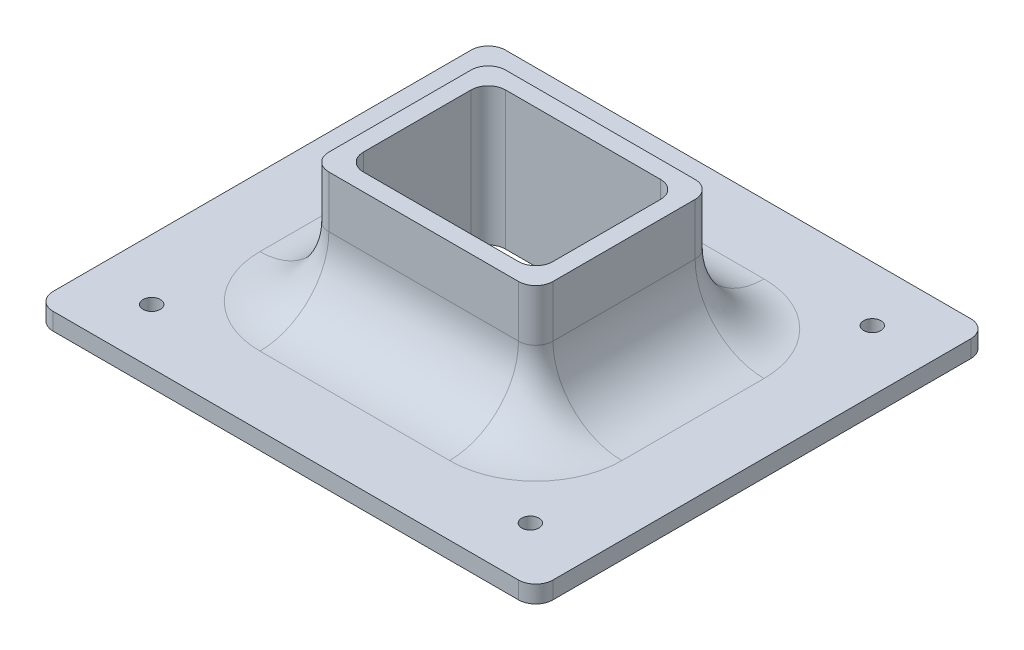
ISO-10303-21;
HEADER;
FILE_DESCRIPTION(('STEP AP214'),'2;1');
FILE_NAME('part.step','',(''),(''),'','','');
FILE_SCHEMA(('AUTOMOTIVE_DESIGN { 1 0 10303 214 1 1 1 1 }'));
ENDSEC;
DATA;
#1=APPLICATION_CONTEXT('core data for automotive mechanical design processes');
#2=APPLICATION_PROTOCOL_DEFINITION('international standard','automotive_design',2000,#1);
#3=PRODUCT_CONTEXT('',#1,'mechanical');
#4=PRODUCT('Part','Part','',(#3));
#5=PRODUCT_RELATED_PRODUCT_CATEGORY('part','',(#4));
#6=PRODUCT_DEFINITION_FORMATION('','',#4);
#7=PRODUCT_DEFINITION_CONTEXT('part definition',#1,'design');
#8=PRODUCT_DEFINITION('design','',#6,#7);
#9=PRODUCT_DEFINITION_SHAPE('','',#8);
#10=(LENGTH_UNIT() NAMED_UNIT(*) SI_UNIT(.MILLI.,.METRE.));
#11=(NAMED_UNIT(*) PLANE_ANGLE_UNIT() SI_UNIT($,.RADIAN.));
#12=(NAMED_UNIT(*) SI_UNIT($,.STERADIAN.) SOLID_ANGLE_UNIT());
#13=UNCERTAINTY_MEASURE_WITH_UNIT(LENGTH_MEASURE(1.E-05),#10,'distance_accuracy_value','');
#14=(GEOMETRIC_REPRESENTATION_CONTEXT(3) GLOBAL_UNCERTAINTY_ASSIGNED_CONTEXT((#13)) GLOBAL_UNIT_ASSIGNED_CONTEXT((#10,
#11,#12)) REPRESENTATION_CONTEXT('',''));
#15=CARTESIAN_POINT('',(0.,0.,0.));
#16=DIRECTION('',(0.,0.,1.));
#17=DIRECTION('',(1.,0.,0.));
#18=AXIS2_PLACEMENT_3D('',#15,#16,#17);
#19=CARTESIAN_POINT('',(0.,44.45,0.));
#20=DIRECTION('',(0.,-1.,0.));
#21=DIRECTION('',(0.,0.,-1.));
#22=AXIS2_PLACEMENT_3D('',#19,#20,#21);
#23=PLANE('',#22);
#24=DIRECTION('',(-1.,0.,0.));
#25=VECTOR('',#24,1.);
#26=CARTESIAN_POINT('',(-6.35,44.45,-58.7248));
#27=LINE('',#26,#25);
#28=CARTESIAN_POINT('',(69.85,44.45,-58.7248));
#29=VERTEX_POINT('',#28);
#30=CARTESIAN_POINT('',(0.,44.45,-58.7248));
#31=VERTEX_POINT('',#30);
#32=EDGE_CURVE('E368',#29,#31,#27,.T.);
#33=ORIENTED_EDGE('',*,*,#32,.T.);
#34=CARTESIAN_POINT('',(0.,44.45,-52.3748));
#35=DIRECTION('',(0.,-1.,0.));
#36=DIRECTION('',(0.,0.,-1.));
#37=AXIS2_PLACEMENT_3D('',#34,#35,#36);
#38=CIRCLE('',#37,6.35);
#39=CARTESIAN_POINT('',(-6.35,44.45,-52.3748));
#40=VERTEX_POINT('',#39);
#41=EDGE_CURVE('E465',#31,#40,#38,.F.);
#42=ORIENTED_EDGE('',*,*,#41,.T.);
#43=DIRECTION('',(0.,0.,1.));
#44=VECTOR('',#43,1.);
#45=CARTESIAN_POINT('',(-6.35,44.45,6.35));
#46=LINE('',#45,#44);
#47=CARTESIAN_POINT('',(-6.35,44.45,0.));
#48=VERTEX_POINT('',#47);
#49=EDGE_CURVE('E356',#40,#48,#46,.T.);
#50=ORIENTED_EDGE('',*,*,#49,.T.);
#51=CARTESIAN_POINT('',(0.,44.45,0.));
#52=DIRECTION('',(0.,-1.,0.));
#53=DIRECTION('',(0.,0.,-1.));
#54=AXIS2_PLACEMENT_3D('',#51,#52,#53);
#55=CIRCLE('',#54,6.35);
#56=CARTESIAN_POINT('',(0.,44.45,6.35));
#57=VERTEX_POINT('',#56);
#58=EDGE_CURVE('E462',#48,#57,#55,.F.);
#59=ORIENTED_EDGE('',*,*,#58,.T.);
#60=DIRECTION('',(1.,0.,0.));
#61=VECTOR('',#60,1.);
#62=CARTESIAN_POINT('',(-6.35,44.45,6.35));
#63=LINE('',#62,#61);
#64=CARTESIAN_POINT('',(69.85,44.45,6.35));
#65=VERTEX_POINT('',#64);
#66=EDGE_CURVE('E360',#57,#65,#63,.T.);
#67=ORIENTED_EDGE('',*,*,#66,.T.);
#68=CARTESIAN_POINT('',(69.85,44.45,0.));
#69=DIRECTION('',(0.,-1.,0.));
#70=DIRECTION('',(0.,0.,-1.));
#71=AXIS2_PLACEMENT_3D('',#68,#69,#70);
#72=CIRCLE('',#71,6.35);
#73=CARTESIAN_POINT('',(76.2,44.45,0.));
#74=VERTEX_POINT('',#73);
#75=EDGE_CURVE('E456',#65,#74,#72,.F.);
#76=ORIENTED_EDGE('',*,*,#75,.T.);
#77=DIRECTION('',(0.,0.,-1.));
#78=VECTOR('',#77,1.);
#79=CARTESIAN_POINT('',(76.2,44.45,6.35));
#80=LINE('',#79,#78);
#81=CARTESIAN_POINT('',(76.2,44.45,-52.3748));
#82=VERTEX_POINT('',#81);
#83=EDGE_CURVE('E364',#74,#82,#80,.T.);
#84=ORIENTED_EDGE('',*,*,#83,.T.);
#85=CARTESIAN_POINT('',(69.85,44.45,-52.3748));
#86=DIRECTION('',(0.,-1.,0.));
#87=DIRECTION('',(0.,0.,-1.));
#88=AXIS2_PLACEMENT_3D('',#85,#86,#87);
#89=CIRCLE('',#88,6.35);
#90=EDGE_CURVE('E459',#82,#29,#89,.F.);
#91=ORIENTED_EDGE('',*,*,#90,.T.);
#92=EDGE_LOOP('',(#33,#42,#50,#59,#67,#76,#84,#91));
#93=FACE_BOUND('',#92,.T.);
#94=DIRECTION('',(0.,0.,1.));
#95=VECTOR('',#94,1.);
#96=CARTESIAN_POINT('',(0.,44.45,0.));
#97=LINE('',#96,#95);
#98=CARTESIAN_POINT('',(0.,44.45,-46.0248));
#99=VERTEX_POINT('',#98);
#100=CARTESIAN_POINT('',(0.,44.45,-6.35));
#101=VERTEX_POINT('',#100);
#102=EDGE_CURVE('E327',#99,#101,#97,.T.);
#103=ORIENTED_EDGE('',*,*,#102,.F.);
#104=CARTESIAN_POINT('',(6.35,44.45,-46.0248));
#105=DIRECTION('',(0.,-1.,0.));
#106=DIRECTION('',(0.,0.,-1.));
#107=AXIS2_PLACEMENT_3D('',#104,#105,#106);
#108=CIRCLE('',#107,6.35);
#109=CARTESIAN_POINT('',(6.35,44.45,-52.3748));
#110=VERTEX_POINT('',#109);
#111=EDGE_CURVE('E236',#99,#110,#108,.T.);
#112=ORIENTED_EDGE('',*,*,#111,.T.);
#113=DIRECTION('',(-1.,0.,0.));
#114=VECTOR('',#113,1.);
#115=CARTESIAN_POINT('',(0.,44.45,-52.3748));
#116=LINE('',#115,#114);
#117=CARTESIAN_POINT('',(63.5,44.45,-52.3748));
#118=VERTEX_POINT('',#117);
#119=EDGE_CURVE('E352',#118,#110,#116,.T.);
#120=ORIENTED_EDGE('',*,*,#119,.F.);
#121=CARTESIAN_POINT('',(63.5,44.45,-46.0248));
#122=DIRECTION('',(0.,-1.,0.));
#123=DIRECTION('',(0.,0.,-1.));
#124=AXIS2_PLACEMENT_3D('',#121,#122,#123);
#125=CIRCLE('',#124,6.35);
#126=CARTESIAN_POINT('',(69.85,44.45,-46.0248));
#127=VERTEX_POINT('',#126);
#128=EDGE_CURVE('E488',#118,#127,#125,.T.);
#129=ORIENTED_EDGE('',*,*,#128,.T.);
#130=DIRECTION('',(0.,0.,-1.));
#131=VECTOR('',#130,1.);
#132=CARTESIAN_POINT('',(69.85,44.45,0.));
#133=LINE('',#132,#131);
#134=CARTESIAN_POINT('',(69.85,44.45,-6.35));
#135=VERTEX_POINT('',#134);
#136=EDGE_CURVE('E348',#135,#127,#133,.T.);
#137=ORIENTED_EDGE('',*,*,#136,.F.);
#138=CARTESIAN_POINT('',(63.5,44.45,-6.35));
#139=DIRECTION('',(0.,-1.,0.));
#140=DIRECTION('',(0.,0.,-1.));
#141=AXIS2_PLACEMENT_3D('',#138,#139,#140);
#142=CIRCLE('',#141,6.35);
#143=CARTESIAN_POINT('',(63.5,44.45,0.));
#144=VERTEX_POINT('',#143);
#145=EDGE_CURVE('E485',#135,#144,#142,.T.);
#146=ORIENTED_EDGE('',*,*,#145,.T.);
#147=DIRECTION('',(1.,0.,0.));
#148=VECTOR('',#147,1.);
#149=CARTESIAN_POINT('',(0.,44.45,0.));
#150=LINE('',#149,#148);
#151=CARTESIAN_POINT('',(6.35,44.45,0.));
#152=VERTEX_POINT('',#151);
#153=EDGE_CURVE('E344',#152,#144,#150,.T.);
#154=ORIENTED_EDGE('',*,*,#153,.F.);
#155=CARTESIAN_POINT('',(6.35,44.45,-6.35));
#156=DIRECTION('',(0.,-1.,0.));
#157=DIRECTION('',(0.,0.,-1.));
#158=AXIS2_PLACEMENT_3D('',#155,#156,#157);
#159=CIRCLE('',#158,6.35);
#160=EDGE_CURVE('E482',#152,#101,#159,.T.);
#161=ORIENTED_EDGE('',*,*,#160,.T.);
#162=EDGE_LOOP('',(#103,#112,#120,#129,#137,#146,#154,#161));
#163=FACE_BOUND('',#162,.T.);
#164=ADVANCED_FACE('F41',(#93,#163),#23,.F.);
#165=CARTESIAN_POINT('',(-6.35,44.45,6.35));
#166=DIRECTION('',(1.,0.,0.));
#167=DIRECTION('',(0.,0.,-1.));
#168=AXIS2_PLACEMENT_3D('',#165,#166,#167);
#169=PLANE('',#168);
#170=DIRECTION('',(0.,-1.,0.));
#171=VECTOR('',#170,1.);
#172=CARTESIAN_POINT('',(-6.35,44.45,-52.3748));
#173=LINE('',#172,#171);
#174=CARTESIAN_POINT('',(-6.35,25.4,-52.3748));
#175=VERTEX_POINT('',#174);
#176=EDGE_CURVE('E446',#40,#175,#173,.T.);
#177=ORIENTED_EDGE('',*,*,#176,.T.);
#178=DIRECTION('',(0.,0.,1.));
#179=VECTOR('',#178,1.);
#180=CARTESIAN_POINT('',(-6.35,25.4,6.35));
#181=LINE('',#180,#179);
#182=CARTESIAN_POINT('',(-6.35,25.4,0.));
#183=VERTEX_POINT('',#182);
#184=EDGE_CURVE('E534',#175,#183,#181,.T.);
#185=ORIENTED_EDGE('',*,*,#184,.T.);
#186=DIRECTION('',(0.,-1.,0.));
#187=VECTOR('',#186,1.);
#188=CARTESIAN_POINT('',(-6.35,44.45,0.));
#189=LINE('',#188,#187);
#190=EDGE_CURVE('E443',#183,#48,#189,.F.);
#191=ORIENTED_EDGE('',*,*,#190,.T.);
#192=ORIENTED_EDGE('',*,*,#49,.F.);
#193=EDGE_LOOP('',(#177,#185,#191,#192));
#194=FACE_BOUND('',#193,.T.);
#195=ADVANCED_FACE('F625',(#194),#169,.F.);
#196=CARTESIAN_POINT('',(-6.35,44.45,6.35));
#197=DIRECTION('',(0.,0.,-1.));
#198=DIRECTION('',(-1.,0.,0.));
#199=AXIS2_PLACEMENT_3D('',#196,#197,#198);
#200=PLANE('',#199);
#201=DIRECTION('',(0.,-1.,0.));
#202=VECTOR('',#201,1.);
#203=CARTESIAN_POINT('',(0.,44.45,6.35));
#204=LINE('',#203,#202);
#205=CARTESIAN_POINT('',(0.,25.4,6.35));
#206=VERTEX_POINT('',#205);
#207=EDGE_CURVE('E471',#57,#206,#204,.T.);
#208=ORIENTED_EDGE('',*,*,#207,.T.);
#209=DIRECTION('',(1.,0.,0.));
#210=VECTOR('',#209,1.);
#211=CARTESIAN_POINT('',(-6.35,25.4,6.35));
#212=LINE('',#211,#210);
#213=CARTESIAN_POINT('',(69.85,25.4,6.35));
#214=VERTEX_POINT('',#213);
#215=EDGE_CURVE('E528',#206,#214,#212,.T.);
#216=ORIENTED_EDGE('',*,*,#215,.T.);
#217=DIRECTION('',(0.,-1.,0.));
#218=VECTOR('',#217,1.);
#219=CARTESIAN_POINT('',(69.85,44.45,6.35));
#220=LINE('',#219,#218);
#221=EDGE_CURVE('E468',#214,#65,#220,.F.);
#222=ORIENTED_EDGE('',*,*,#221,.T.);
#223=ORIENTED_EDGE('',*,*,#66,.F.);
#224=EDGE_LOOP('',(#208,#216,#222,#223));
#225=FACE_BOUND('',#224,.T.);
#226=ADVANCED_FACE('F584',(#225),#200,.F.);
#227=CARTESIAN_POINT('',(76.2,44.45,6.35));
#228=DIRECTION('',(-1.,0.,0.));
#229=DIRECTION('',(0.,0.,1.));
#230=AXIS2_PLACEMENT_3D('',#227,#228,#229);
#231=PLANE('',#230);
#232=DIRECTION('',(0.,-1.,0.));
#233=VECTOR('',#232,1.);
#234=CARTESIAN_POINT('',(76.2,44.45,0.));
#235=LINE('',#234,#233);
#236=CARTESIAN_POINT('',(76.2,25.4,0.));
#237=VERTEX_POINT('',#236);
#238=EDGE_CURVE('E475',#74,#237,#235,.T.);
#239=ORIENTED_EDGE('',*,*,#238,.T.);
#240=DIRECTION('',(0.,0.,-1.));
#241=VECTOR('',#240,1.);
#242=CARTESIAN_POINT('',(76.2,25.4,6.35));
#243=LINE('',#242,#241);
#244=CARTESIAN_POINT('',(76.2,25.4,-52.3748));
#245=VERTEX_POINT('',#244);
#246=EDGE_CURVE('E522',#237,#245,#243,.T.);
#247=ORIENTED_EDGE('',*,*,#246,.T.);
#248=DIRECTION('',(0.,-1.,0.));
#249=VECTOR('',#248,1.);
#250=CARTESIAN_POINT('',(76.2,44.45,-52.3748));
#251=LINE('',#250,#249);
#252=EDGE_CURVE('E479',#245,#82,#251,.F.);
#253=ORIENTED_EDGE('',*,*,#252,.T.);
#254=ORIENTED_EDGE('',*,*,#83,.F.);
#255=EDGE_LOOP('',(#239,#247,#253,#254));
#256=FACE_BOUND('',#255,.T.);
#257=ADVANCED_FACE('F597',(#256),#231,.F.);
#258=CARTESIAN_POINT('',(-6.35,44.45,-58.7248));
#259=DIRECTION('',(0.,0.,1.));
#260=DIRECTION('',(1.,0.,0.));
#261=AXIS2_PLACEMENT_3D('',#258,#259,#260);
#262=PLANE('',#261);
#263=DIRECTION('',(0.,-1.,0.));
#264=VECTOR('',#263,1.);
#265=CARTESIAN_POINT('',(69.85,44.45,-58.7248));
#266=LINE('',#265,#264);
#267=CARTESIAN_POINT('',(69.85,25.4,-58.7248));
#268=VERTEX_POINT('',#267);
#269=EDGE_CURVE('E450',#29,#268,#266,.T.);
#270=ORIENTED_EDGE('',*,*,#269,.T.);
#271=DIRECTION('',(-1.,0.,0.));
#272=VECTOR('',#271,1.);
#273=CARTESIAN_POINT('',(-6.35,25.4,-58.7248));
#274=LINE('',#273,#272);
#275=CARTESIAN_POINT('',(0.,25.4,-58.7248));
#276=VERTEX_POINT('',#275);
#277=EDGE_CURVE('E11',#268,#276,#274,.T.);
#278=ORIENTED_EDGE('',*,*,#277,.T.);
#279=DIRECTION('',(0.,-1.,0.));
#280=VECTOR('',#279,1.);
#281=CARTESIAN_POINT('',(0.,44.45,-58.7248));
#282=LINE('',#281,#280);
#283=EDGE_CURVE('E453',#276,#31,#282,.F.);
#284=ORIENTED_EDGE('',*,*,#283,.T.);
#285=ORIENTED_EDGE('',*,*,#32,.F.);
#286=EDGE_LOOP('',(#270,#278,#284,#285));
#287=FACE_BOUND('',#286,.T.);
#288=ADVANCED_FACE('F617',(#287),#262,.F.);
#289=CARTESIAN_POINT('',(0.,44.45,0.));
#290=DIRECTION('',(1.,0.,0.));
#291=DIRECTION('',(0.,0.,-1.));
#292=AXIS2_PLACEMENT_3D('',#289,#290,#291);
#293=PLANE('',#292);
#294=ORIENTED_EDGE('',*,*,#102,.T.);
#295=DIRECTION('',(0.,-1.,0.));
#296=VECTOR('',#295,1.);
#297=CARTESIAN_POINT('',(0.,0.,-6.35));
#298=LINE('',#297,#296);
#299=CARTESIAN_POINT('',(0.,-6.35,-6.35));
#300=VERTEX_POINT('',#299);
#301=EDGE_CURVE('E59',#101,#300,#298,.T.);
#302=ORIENTED_EDGE('',*,*,#301,.T.);
#303=DIRECTION('',(0.,0.,1.));
#304=VECTOR('',#303,1.);
#305=CARTESIAN_POINT('',(0.,-6.35,-46.0248));
#306=LINE('',#305,#304);
#307=CARTESIAN_POINT('',(0.,-6.35,-46.0248));
#308=VERTEX_POINT('',#307);
#309=EDGE_CURVE('E242',#308,#300,#306,.T.);
#310=ORIENTED_EDGE('',*,*,#309,.F.);
#311=DIRECTION('',(0.,-1.,0.));
#312=VECTOR('',#311,1.);
#313=CARTESIAN_POINT('',(0.,44.45,-46.0248));
#314=LINE('',#313,#312);
#315=EDGE_CURVE('E230',#308,#99,#314,.F.);
#316=ORIENTED_EDGE('',*,*,#315,.T.);
#317=EDGE_LOOP('',(#294,#302,#310,#316));
#318=FACE_BOUND('',#317,.T.);
#319=ADVANCED_FACE('F243',(#318),#293,.T.);
#320=CARTESIAN_POINT('',(0.,44.45,0.));
#321=DIRECTION('',(0.,0.,-1.));
#322=DIRECTION('',(-1.,0.,0.));
#323=AXIS2_PLACEMENT_3D('',#320,#321,#322);
#324=PLANE('',#323);
#325=DIRECTION('',(0.,-1.,0.));
#326=VECTOR('',#325,1.);
#327=CARTESIAN_POINT('',(63.5,0.,0.));
#328=LINE('',#327,#326);
#329=CARTESIAN_POINT('',(63.5,-6.35,0.));
#330=VERTEX_POINT('',#329);
#331=EDGE_CURVE('E425',#144,#330,#328,.T.);
#332=ORIENTED_EDGE('',*,*,#331,.T.);
#333=DIRECTION('',(1.,0.,0.));
#334=VECTOR('',#333,1.);
#335=CARTESIAN_POINT('',(6.35,-6.35,0.));
#336=LINE('',#335,#334);
#337=CARTESIAN_POINT('',(6.35,-6.35,0.));
#338=VERTEX_POINT('',#337);
#339=EDGE_CURVE('E259',#338,#330,#336,.T.);
#340=ORIENTED_EDGE('',*,*,#339,.F.);
#341=DIRECTION('',(0.,-1.,0.));
#342=VECTOR('',#341,1.);
#343=CARTESIAN_POINT('',(6.35,44.45,0.));
#344=LINE('',#343,#342);
#345=EDGE_CURVE('E428',#338,#152,#344,.F.);
#346=ORIENTED_EDGE('',*,*,#345,.T.);
#347=ORIENTED_EDGE('',*,*,#153,.T.);
#348=EDGE_LOOP('',(#332,#340,#346,#347));
#349=FACE_BOUND('',#348,.T.);
#350=ADVANCED_FACE('F744',(#349),#324,.T.);
#351=CARTESIAN_POINT('',(69.85,44.45,0.));
#352=DIRECTION('',(-1.,0.,0.));
#353=DIRECTION('',(0.,0.,1.));
#354=AXIS2_PLACEMENT_3D('',#351,#352,#353);
#355=PLANE('',#354);
#356=DIRECTION('',(0.,-1.,0.));
#357=VECTOR('',#356,1.);
#358=CARTESIAN_POINT('',(69.85,0.,-46.0248));
#359=LINE('',#358,#357);
#360=CARTESIAN_POINT('',(69.85,-6.35,-46.0248));
#361=VERTEX_POINT('',#360);
#362=EDGE_CURVE('E431',#127,#361,#359,.T.);
#363=ORIENTED_EDGE('',*,*,#362,.T.);
#364=DIRECTION('',(0.,0.,-1.));
#365=VECTOR('',#364,1.);
#366=CARTESIAN_POINT('',(69.85,-6.35,-6.35));
#367=LINE('',#366,#365);
#368=CARTESIAN_POINT('',(69.85,-6.35,-6.35));
#369=VERTEX_POINT('',#368);
#370=EDGE_CURVE('E267',#369,#361,#367,.T.);
#371=ORIENTED_EDGE('',*,*,#370,.F.);
#372=DIRECTION('',(0.,-1.,0.));
#373=VECTOR('',#372,1.);
#374=CARTESIAN_POINT('',(69.85,44.45,-6.35));
#375=LINE('',#374,#373);
#376=EDGE_CURVE('E434',#369,#135,#375,.F.);
#377=ORIENTED_EDGE('',*,*,#376,.T.);
#378=ORIENTED_EDGE('',*,*,#136,.T.);
#379=EDGE_LOOP('',(#363,#371,#377,#378));
#380=FACE_BOUND('',#379,.T.);
#381=ADVANCED_FACE('F740',(#380),#355,.T.);
#382=CARTESIAN_POINT('',(0.,44.45,-52.3748));
#383=DIRECTION('',(0.,0.,1.));
#384=DIRECTION('',(1.,0.,0.));
#385=AXIS2_PLACEMENT_3D('',#382,#383,#384);
#386=PLANE('',#385);
#387=DIRECTION('',(0.,-1.,0.));
#388=VECTOR('',#387,1.);
#389=CARTESIAN_POINT('',(6.35,0.,-52.3748));
#390=LINE('',#389,#388);
#391=CARTESIAN_POINT('',(6.35,-6.35,-52.3748));
#392=VERTEX_POINT('',#391);
#393=EDGE_CURVE('E437',#110,#392,#390,.T.);
#394=ORIENTED_EDGE('',*,*,#393,.T.);
#395=DIRECTION('',(-1.,0.,0.));
#396=VECTOR('',#395,1.);
#397=CARTESIAN_POINT('',(63.5,-6.35,-52.3748));
#398=LINE('',#397,#396);
#399=CARTESIAN_POINT('',(63.5,-6.35,-52.3748));
#400=VERTEX_POINT('',#399);
#401=EDGE_CURVE('E253',#400,#392,#398,.T.);
#402=ORIENTED_EDGE('',*,*,#401,.F.);
#403=DIRECTION('',(0.,-1.,0.));
#404=VECTOR('',#403,1.);
#405=CARTESIAN_POINT('',(63.5,44.45,-52.3748));
#406=LINE('',#405,#404);
#407=EDGE_CURVE('E440',#400,#118,#406,.F.);
#408=ORIENTED_EDGE('',*,*,#407,.T.);
#409=ORIENTED_EDGE('',*,*,#119,.T.);
#410=EDGE_LOOP('',(#394,#402,#408,#409));
#411=FACE_BOUND('',#410,.T.);
#412=ADVANCED_FACE('F722',(#411),#386,.T.);
#413=CARTESIAN_POINT('',(0.,0.,0.));
#414=DIRECTION('',(0.,1.,0.));
#415=DIRECTION('',(0.,0.,1.));
#416=AXIS2_PLACEMENT_3D('',#413,#414,#415);
#417=PLANE('',#416);
#418=DIRECTION('',(-1.,0.,0.));
#419=VECTOR('',#418,1.);
#420=CARTESIAN_POINT('',(0.,0.,-84.1248));
#421=LINE('',#420,#419);
#422=CARTESIAN_POINT('',(0.,0.,-84.1248));
#423=VERTEX_POINT('',#422);
#424=CARTESIAN_POINT('',(69.85,0.,-84.1248));
#425=VERTEX_POINT('',#424);
#426=EDGE_CURVE('E493',#423,#425,#421,.F.);
#427=ORIENTED_EDGE('',*,*,#426,.T.);
#428=CARTESIAN_POINT('',(69.85,0.,-52.3748));
#429=DIRECTION('',(0.,1.,0.));
#430=DIRECTION('',(0.,0.,1.));
#431=AXIS2_PLACEMENT_3D('',#428,#429,#430);
#432=CIRCLE('',#431,31.75);
#433=CARTESIAN_POINT('',(101.6,0.,-52.3748));
#434=VERTEX_POINT('',#433);
#435=EDGE_CURVE('E514',#425,#434,#432,.F.);
#436=ORIENTED_EDGE('',*,*,#435,.T.);
#437=DIRECTION('',(0.,0.,-1.));
#438=VECTOR('',#437,1.);
#439=CARTESIAN_POINT('',(101.6,0.,0.));
#440=LINE('',#439,#438);
#441=CARTESIAN_POINT('',(101.6,0.,0.));
#442=VERTEX_POINT('',#441);
#443=EDGE_CURVE('E511',#434,#442,#440,.F.);
#444=ORIENTED_EDGE('',*,*,#443,.T.);
#445=CARTESIAN_POINT('',(69.85,0.,0.));
#446=DIRECTION('',(0.,1.,0.));
#447=DIRECTION('',(0.,0.,1.));
#448=AXIS2_PLACEMENT_3D('',#445,#446,#447);
#449=CIRCLE('',#448,31.75);
#450=CARTESIAN_POINT('',(69.85,0.,31.75));
#451=VERTEX_POINT('',#450);
#452=EDGE_CURVE('E508',#442,#451,#449,.F.);
#453=ORIENTED_EDGE('',*,*,#452,.T.);
#454=DIRECTION('',(1.,0.,0.));
#455=VECTOR('',#454,1.);
#456=CARTESIAN_POINT('',(0.,0.,31.75));
#457=LINE('',#456,#455);
#458=CARTESIAN_POINT('',(0.,0.,31.75));
#459=VERTEX_POINT('',#458);
#460=EDGE_CURVE('E505',#451,#459,#457,.F.);
#461=ORIENTED_EDGE('',*,*,#460,.T.);
#462=CARTESIAN_POINT('',(0.,0.,0.));
#463=DIRECTION('',(0.,1.,0.));
#464=DIRECTION('',(0.,0.,1.));
#465=AXIS2_PLACEMENT_3D('',#462,#463,#464);
#466=CIRCLE('',#465,31.75);
#467=CARTESIAN_POINT('',(-31.75,0.,0.));
#468=VERTEX_POINT('',#467);
#469=EDGE_CURVE('E502',#459,#468,#466,.F.);
#470=ORIENTED_EDGE('',*,*,#469,.T.);
#471=DIRECTION('',(0.,0.,1.));
#472=VECTOR('',#471,1.);
#473=CARTESIAN_POINT('',(-31.75,0.,0.));
#474=LINE('',#473,#472);
#475=CARTESIAN_POINT('',(-31.75,0.,-52.3748));
#476=VERTEX_POINT('',#475);
#477=EDGE_CURVE('E499',#468,#476,#474,.F.);
#478=ORIENTED_EDGE('',*,*,#477,.T.);
#479=CARTESIAN_POINT('',(0.,0.,-52.3748));
#480=DIRECTION('',(0.,1.,0.));
#481=DIRECTION('',(0.,0.,1.));
#482=AXIS2_PLACEMENT_3D('',#479,#480,#481);
#483=CIRCLE('',#482,31.75);
#484=EDGE_CURVE('E496',#476,#423,#483,.F.);
#485=ORIENTED_EDGE('',*,*,#484,.T.);
#486=EDGE_LOOP('',(#427,#436,#444,#453,#461,#470,#478,#485));
#487=FACE_BOUND('',#486,.T.);
#488=CARTESIAN_POINT('',(-34.8205380955821,0.,-89.1778779768951));
#489=DIRECTION('',(0.,1.,0.));
#490=DIRECTION('',(0.,0.,1.));
#491=AXIS2_PLACEMENT_3D('',#488,#489,#490);
#492=CIRCLE('',#491,3.175);
#493=CARTESIAN_POINT('',(-34.8205380955821,0.,-86.0028779768951));
#494=VERTEX_POINT('',#493);
#495=EDGE_CURVE('E298',#494,#494,#492,.T.);
#496=ORIENTED_EDGE('',*,*,#495,.F.);
#497=EDGE_LOOP('',(#496));
#498=FACE_BOUND('',#497,.T.);
#499=CARTESIAN_POINT('',(104.670538095582,0.,36.8030779768951));
#500=DIRECTION('',(0.,1.,0.));
#501=DIRECTION('',(0.,0.,1.));
#502=AXIS2_PLACEMENT_3D('',#499,#500,#501);
#503=CIRCLE('',#502,3.175);
#504=CARTESIAN_POINT('',(104.670538095582,0.,39.9780779768951));
#505=VERTEX_POINT('',#504);
#506=EDGE_CURVE('E290',#505,#505,#503,.T.);
#507=ORIENTED_EDGE('',*,*,#506,.F.);
#508=EDGE_LOOP('',(#507));
#509=FACE_BOUND('',#508,.T.);
#510=CARTESIAN_POINT('',(-34.8205380955822,0.,36.8030779768951));
#511=DIRECTION('',(0.,1.,0.));
#512=DIRECTION('',(0.,0.,1.));
#513=AXIS2_PLACEMENT_3D('',#510,#511,#512);
#514=CIRCLE('',#513,3.17500000000001);
#515=CARTESIAN_POINT('',(-34.8205380955822,0.,39.9780779768951));
#516=VERTEX_POINT('',#515);
#517=EDGE_CURVE('E282',#516,#516,#514,.T.);
#518=ORIENTED_EDGE('',*,*,#517,.F.);
#519=EDGE_LOOP('',(#518));
#520=FACE_BOUND('',#519,.T.);
#521=CARTESIAN_POINT('',(104.670538095582,0.,-89.1778779768951));
#522=DIRECTION('',(0.,1.,0.));
#523=DIRECTION('',(0.,0.,1.));
#524=AXIS2_PLACEMENT_3D('',#521,#522,#523);
#525=CIRCLE('',#524,3.175);
#526=CARTESIAN_POINT('',(104.670538095582,0.,-86.0028779768951));
#527=VERTEX_POINT('',#526);
#528=EDGE_CURVE('E281',#527,#527,#525,.T.);
#529=ORIENTED_EDGE('',*,*,#528,.F.);
#530=EDGE_LOOP('',(#529));
#531=FACE_BOUND('',#530,.T.);
#532=DIRECTION('',(0.,0.,1.));
#533=VECTOR('',#532,1.);
#534=CARTESIAN_POINT('',(127.,0.,57.15));
#535=LINE('',#534,#533);
#536=CARTESIAN_POINT('',(127.,0.,-103.1748));
#537=VERTEX_POINT('',#536);
#538=CARTESIAN_POINT('',(127.,0.,50.8));
#539=VERTEX_POINT('',#538);
#540=EDGE_CURVE('E335',#537,#539,#535,.T.);
#541=ORIENTED_EDGE('',*,*,#540,.F.);
#542=CARTESIAN_POINT('',(120.65,0.,-103.1748));
#543=DIRECTION('',(0.,1.,0.));
#544=DIRECTION('',(0.,0.,1.));
#545=AXIS2_PLACEMENT_3D('',#542,#543,#544);
#546=CIRCLE('',#545,6.35);
#547=CARTESIAN_POINT('',(120.65,0.,-109.5248));
#548=VERTEX_POINT('',#547);
#549=EDGE_CURVE('E388',#537,#548,#546,.T.);
#550=ORIENTED_EDGE('',*,*,#549,.T.);
#551=DIRECTION('',(1.,0.,0.));
#552=VECTOR('',#551,1.);
#553=CARTESIAN_POINT('',(127.,0.,-109.5248));
#554=LINE('',#553,#552);
#555=CARTESIAN_POINT('',(-50.8,0.,-109.5248));
#556=VERTEX_POINT('',#555);
#557=EDGE_CURVE('E331',#556,#548,#554,.T.);
#558=ORIENTED_EDGE('',*,*,#557,.F.);
#559=CARTESIAN_POINT('',(-50.8,0.,-103.1748));
#560=DIRECTION('',(0.,1.,0.));
#561=DIRECTION('',(0.,0.,1.));
#562=AXIS2_PLACEMENT_3D('',#559,#560,#561);
#563=CIRCLE('',#562,6.35);
#564=CARTESIAN_POINT('',(-57.15,0.,-103.1748));
#565=VERTEX_POINT('',#564);
#566=EDGE_CURVE('E385',#556,#565,#563,.T.);
#567=ORIENTED_EDGE('',*,*,#566,.T.);
#568=DIRECTION('',(0.,0.,-1.));
#569=VECTOR('',#568,1.);
#570=CARTESIAN_POINT('',(-57.15,0.,-109.5248));
#571=LINE('',#570,#569);
#572=CARTESIAN_POINT('',(-57.15,0.,50.8));
#573=VERTEX_POINT('',#572);
#574=EDGE_CURVE('E306',#573,#565,#571,.T.);
#575=ORIENTED_EDGE('',*,*,#574,.F.);
#576=CARTESIAN_POINT('',(-50.8,0.,50.8));
#577=DIRECTION('',(0.,1.,0.));
#578=DIRECTION('',(0.,0.,1.));
#579=AXIS2_PLACEMENT_3D('',#576,#577,#578);
#580=CIRCLE('',#579,6.35);
#581=CARTESIAN_POINT('',(-50.8,0.,57.15));
#582=VERTEX_POINT('',#581);
#583=EDGE_CURVE('E379',#573,#582,#580,.T.);
#584=ORIENTED_EDGE('',*,*,#583,.T.);
#585=DIRECTION('',(-1.,0.,0.));
#586=VECTOR('',#585,1.);
#587=CARTESIAN_POINT('',(-57.15,0.,57.15));
#588=LINE('',#587,#586);
#589=CARTESIAN_POINT('',(120.65,0.,57.15));
#590=VERTEX_POINT('',#589);
#591=EDGE_CURVE('E315',#590,#582,#588,.T.);
#592=ORIENTED_EDGE('',*,*,#591,.F.);
#593=CARTESIAN_POINT('',(120.65,0.,50.8));
#594=DIRECTION('',(0.,1.,0.));
#595=DIRECTION('',(0.,0.,1.));
#596=AXIS2_PLACEMENT_3D('',#593,#594,#595);
#597=CIRCLE('',#596,6.35);
#598=EDGE_CURVE('E382',#590,#539,#597,.T.);
#599=ORIENTED_EDGE('',*,*,#598,.T.);
#600=EDGE_LOOP('',(#541,#550,#558,#567,#575,#584,#592,#599));
#601=FACE_BOUND('',#600,.T.);
#602=ADVANCED_FACE('F718',(#487,#498,#509,#520,#531,#601),#417,.T.);
#603=CARTESIAN_POINT('',(-57.15,-6.35,-109.5248));
#604=DIRECTION('',(1.,0.,0.));
#605=DIRECTION('',(0.,0.,-1.));
#606=AXIS2_PLACEMENT_3D('',#603,#604,#605);
#607=PLANE('',#606);
#608=ORIENTED_EDGE('',*,*,#574,.T.);
#609=DIRECTION('',(0.,1.,0.));
#610=VECTOR('',#609,1.);
#611=CARTESIAN_POINT('',(-57.15,-6.35,-103.1748));
#612=LINE('',#611,#610);
#613=CARTESIAN_POINT('',(-57.15,-6.35,-103.1748));
#614=VERTEX_POINT('',#613);
#615=EDGE_CURVE('E414',#565,#614,#612,.F.);
#616=ORIENTED_EDGE('',*,*,#615,.T.);
#617=DIRECTION('',(0.,0.,-1.));
#618=VECTOR('',#617,1.);
#619=CARTESIAN_POINT('',(-57.15,-6.35,-109.5248));
#620=LINE('',#619,#618);
#621=CARTESIAN_POINT('',(-57.15,-6.35,50.8));
#622=VERTEX_POINT('',#621);
#623=EDGE_CURVE('E310',#622,#614,#620,.T.);
#624=ORIENTED_EDGE('',*,*,#623,.F.);
#625=DIRECTION('',(0.,1.,0.));
#626=VECTOR('',#625,1.);
#627=CARTESIAN_POINT('',(-57.15,-6.35,50.8));
#628=LINE('',#627,#626);
#629=EDGE_CURVE('E410',#622,#573,#628,.T.);
#630=ORIENTED_EDGE('',*,*,#629,.T.);
#631=EDGE_LOOP('',(#608,#616,#624,#630));
#632=FACE_BOUND('',#631,.T.);
#633=ADVANCED_FACE('F721',(#632),#607,.F.);
#634=CARTESIAN_POINT('',(127.,-6.35,-109.5248));
#635=DIRECTION('',(0.,0.,1.));
#636=DIRECTION('',(1.,0.,0.));
#637=AXIS2_PLACEMENT_3D('',#634,#635,#636);
#638=PLANE('',#637);
#639=ORIENTED_EDGE('',*,*,#557,.T.);
#640=DIRECTION('',(0.,1.,0.));
#641=VECTOR('',#640,1.);
#642=CARTESIAN_POINT('',(120.65,-6.35,-109.5248));
#643=LINE('',#642,#641);
#644=CARTESIAN_POINT('',(120.65,-6.35,-109.5248));
#645=VERTEX_POINT('',#644);
#646=EDGE_CURVE('E395',#548,#645,#643,.F.);
#647=ORIENTED_EDGE('',*,*,#646,.T.);
#648=DIRECTION('',(1.,0.,0.));
#649=VECTOR('',#648,1.);
#650=CARTESIAN_POINT('',(127.,-6.35,-109.5248));
#651=LINE('',#650,#649);
#652=CARTESIAN_POINT('',(-50.8,-6.35,-109.5248));
#653=VERTEX_POINT('',#652);
#654=EDGE_CURVE('E314',#653,#645,#651,.T.);
#655=ORIENTED_EDGE('',*,*,#654,.F.);
#656=DIRECTION('',(0.,1.,0.));
#657=VECTOR('',#656,1.);
#658=CARTESIAN_POINT('',(-50.8,-6.35,-109.5248));
#659=LINE('',#658,#657);
#660=EDGE_CURVE('E391',#653,#556,#659,.T.);
#661=ORIENTED_EDGE('',*,*,#660,.T.);
#662=EDGE_LOOP('',(#639,#647,#655,#661));
#663=FACE_BOUND('',#662,.T.);
#664=ADVANCED_FACE('F730',(#663),#638,.F.);
#665=CARTESIAN_POINT('',(127.,-6.35,57.15));
#666=DIRECTION('',(-1.,0.,0.));
#667=DIRECTION('',(0.,0.,1.));
#668=AXIS2_PLACEMENT_3D('',#665,#666,#667);
#669=PLANE('',#668);
#670=DIRECTION('',(0.,0.,1.));
#671=VECTOR('',#670,1.);
#672=CARTESIAN_POINT('',(127.,-6.35,57.15));
#673=LINE('',#672,#671);
#674=CARTESIAN_POINT('',(127.,-6.35,-103.1748));
#675=VERTEX_POINT('',#674);
#676=CARTESIAN_POINT('',(127.,-6.35,50.8));
#677=VERTEX_POINT('',#676);
#678=EDGE_CURVE('E319',#675,#677,#673,.T.);
#679=ORIENTED_EDGE('',*,*,#678,.F.);
#680=DIRECTION('',(0.,1.,0.));
#681=VECTOR('',#680,1.);
#682=CARTESIAN_POINT('',(127.,-6.35,-103.1748));
#683=LINE('',#682,#681);
#684=EDGE_CURVE('E375',#675,#537,#683,.T.);
#685=ORIENTED_EDGE('',*,*,#684,.T.);
#686=ORIENTED_EDGE('',*,*,#540,.T.);
#687=DIRECTION('',(0.,1.,0.));
#688=VECTOR('',#687,1.);
#689=CARTESIAN_POINT('',(127.,-6.35,50.8));
#690=LINE('',#689,#688);
#691=EDGE_CURVE('E372',#539,#677,#690,.F.);
#692=ORIENTED_EDGE('',*,*,#691,.T.);
#693=EDGE_LOOP('',(#679,#685,#686,#692));
#694=FACE_BOUND('',#693,.T.);
#695=ADVANCED_FACE('F726',(#694),#669,.F.);
#696=CARTESIAN_POINT('',(-57.15,-6.35,57.15));
#697=DIRECTION('',(0.,0.,-1.));
#698=DIRECTION('',(-1.,0.,0.));
#699=AXIS2_PLACEMENT_3D('',#696,#697,#698);
#700=PLANE('',#699);
#701=DIRECTION('',(-1.,0.,0.));
#702=VECTOR('',#701,1.);
#703=CARTESIAN_POINT('',(-57.15,-6.35,57.15));
#704=LINE('',#703,#702);
#705=CARTESIAN_POINT('',(120.65,-6.35,57.15));
#706=VERTEX_POINT('',#705);
#707=CARTESIAN_POINT('',(-50.8,-6.35,57.15));
#708=VERTEX_POINT('',#707);
#709=EDGE_CURVE('E323',#706,#708,#704,.T.);
#710=ORIENTED_EDGE('',*,*,#709,.F.);
#711=DIRECTION('',(0.,1.,0.));
#712=VECTOR('',#711,1.);
#713=CARTESIAN_POINT('',(120.65,-6.35,57.15));
#714=LINE('',#713,#712);
#715=EDGE_CURVE('E239',#706,#590,#714,.T.);
#716=ORIENTED_EDGE('',*,*,#715,.T.);
#717=ORIENTED_EDGE('',*,*,#591,.T.);
#718=DIRECTION('',(0.,1.,0.));
#719=VECTOR('',#718,1.);
#720=CARTESIAN_POINT('',(-50.8,-6.35,57.15));
#721=LINE('',#720,#719);
#722=EDGE_CURVE('E417',#582,#708,#721,.F.);
#723=ORIENTED_EDGE('',*,*,#722,.T.);
#724=EDGE_LOOP('',(#710,#716,#717,#723));
#725=FACE_BOUND('',#724,.T.);
#726=ADVANCED_FACE('F717',(#725),#700,.F.);
#727=CARTESIAN_POINT('',(0.,-6.35,0.));
#728=DIRECTION('',(0.,1.,0.));
#729=DIRECTION('',(0.,0.,1.));
#730=AXIS2_PLACEMENT_3D('',#727,#728,#729);
#731=PLANE('',#730);
#732=ORIENTED_EDGE('',*,*,#401,.T.);
#733=CARTESIAN_POINT('',(6.35,-6.35,-46.0248));
#734=DIRECTION('',(0.,1.,0.));
#735=DIRECTION('',(0.,0.,1.));
#736=AXIS2_PLACEMENT_3D('',#733,#734,#735);
#737=CIRCLE('',#736,6.35);
#738=EDGE_CURVE('E234',#392,#308,#737,.T.);
#739=ORIENTED_EDGE('',*,*,#738,.T.);
#740=ORIENTED_EDGE('',*,*,#309,.T.);
#741=CARTESIAN_POINT('',(6.35,-6.35,-6.35));
#742=DIRECTION('',(0.,1.,0.));
#743=DIRECTION('',(0.,0.,1.));
#744=AXIS2_PLACEMENT_3D('',#741,#742,#743);
#745=CIRCLE('',#744,6.35);
#746=EDGE_CURVE('E247',#300,#338,#745,.T.);
#747=ORIENTED_EDGE('',*,*,#746,.T.);
#748=ORIENTED_EDGE('',*,*,#339,.T.);
#749=CARTESIAN_POINT('',(63.5,-6.35,-6.35));
#750=DIRECTION('',(0.,1.,0.));
#751=DIRECTION('',(0.,0.,1.));
#752=AXIS2_PLACEMENT_3D('',#749,#750,#751);
#753=CIRCLE('',#752,6.35);
#754=EDGE_CURVE('E263',#330,#369,#753,.T.);
#755=ORIENTED_EDGE('',*,*,#754,.T.);
#756=ORIENTED_EDGE('',*,*,#370,.T.);
#757=CARTESIAN_POINT('',(63.5,-6.35,-46.0248));
#758=DIRECTION('',(0.,1.,0.));
#759=DIRECTION('',(0.,0.,1.));
#760=AXIS2_PLACEMENT_3D('',#757,#758,#759);
#761=CIRCLE('',#760,6.34999999999999);
#762=EDGE_CURVE('E271',#361,#400,#761,.T.);
#763=ORIENTED_EDGE('',*,*,#762,.T.);
#764=EDGE_LOOP('',(#732,#739,#740,#747,#748,#755,#756,#763));
#765=FACE_BOUND('',#764,.T.);
#766=CARTESIAN_POINT('',(-34.8205380955821,-6.35,-89.1778779768951));
#767=DIRECTION('',(0.,1.,0.));
#768=DIRECTION('',(0.,0.,1.));
#769=AXIS2_PLACEMENT_3D('',#766,#767,#768);
#770=CIRCLE('',#769,3.175);
#771=CARTESIAN_POINT('',(-34.8205380955821,-6.35,-86.0028779768951));
#772=VERTEX_POINT('',#771);
#773=EDGE_CURVE('E294',#772,#772,#770,.T.);
#774=ORIENTED_EDGE('',*,*,#773,.T.);
#775=EDGE_LOOP('',(#774));
#776=FACE_BOUND('',#775,.T.);
#777=CARTESIAN_POINT('',(104.670538095582,-6.35,36.8030779768951));
#778=DIRECTION('',(0.,1.,0.));
#779=DIRECTION('',(0.,0.,1.));
#780=AXIS2_PLACEMENT_3D('',#777,#778,#779);
#781=CIRCLE('',#780,3.175);
#782=CARTESIAN_POINT('',(104.670538095582,-6.35,39.9780779768951));
#783=VERTEX_POINT('',#782);
#784=EDGE_CURVE('E286',#783,#783,#781,.T.);
#785=ORIENTED_EDGE('',*,*,#784,.T.);
#786=EDGE_LOOP('',(#785));
#787=FACE_BOUND('',#786,.T.);
#788=CARTESIAN_POINT('',(-34.8205380955822,-6.35,36.8030779768951));
#789=DIRECTION('',(0.,1.,0.));
#790=DIRECTION('',(0.,0.,1.));
#791=AXIS2_PLACEMENT_3D('',#788,#789,#790);
#792=CIRCLE('',#791,3.17500000000001);
#793=CARTESIAN_POINT('',(-34.8205380955822,-6.35,39.9780779768951));
#794=VERTEX_POINT('',#793);
#795=EDGE_CURVE('E277',#794,#794,#792,.T.);
#796=ORIENTED_EDGE('',*,*,#795,.T.);
#797=EDGE_LOOP('',(#796));
#798=FACE_BOUND('',#797,.T.);
#799=CARTESIAN_POINT('',(104.670538095582,-6.35,-89.1778779768951));
#800=DIRECTION('',(0.,1.,0.));
#801=DIRECTION('',(0.,0.,1.));
#802=AXIS2_PLACEMENT_3D('',#799,#800,#801);
#803=CIRCLE('',#802,3.175);
#804=CARTESIAN_POINT('',(104.670538095582,-6.35,-86.0028779768951));
#805=VERTEX_POINT('',#804);
#806=EDGE_CURVE('E302',#805,#805,#803,.T.);
#807=ORIENTED_EDGE('',*,*,#806,.T.);
#808=EDGE_LOOP('',(#807));
#809=FACE_BOUND('',#808,.T.);
#810=ORIENTED_EDGE('',*,*,#654,.T.);
#811=CARTESIAN_POINT('',(120.65,-6.35,-103.1748));
#812=DIRECTION('',(0.,1.,0.));
#813=DIRECTION('',(0.,0.,1.));
#814=AXIS2_PLACEMENT_3D('',#811,#812,#813);
#815=CIRCLE('',#814,6.35);
#816=EDGE_CURVE('E407',#645,#675,#815,.F.);
#817=ORIENTED_EDGE('',*,*,#816,.T.);
#818=ORIENTED_EDGE('',*,*,#678,.T.);
#819=CARTESIAN_POINT('',(120.65,-6.35,50.8));
#820=DIRECTION('',(0.,1.,0.));
#821=DIRECTION('',(0.,0.,1.));
#822=AXIS2_PLACEMENT_3D('',#819,#820,#821);
#823=CIRCLE('',#822,6.35);
#824=EDGE_CURVE('E401',#677,#706,#823,.F.);
#825=ORIENTED_EDGE('',*,*,#824,.T.);
#826=ORIENTED_EDGE('',*,*,#709,.T.);
#827=CARTESIAN_POINT('',(-50.8,-6.35,50.8));
#828=DIRECTION('',(0.,1.,0.));
#829=DIRECTION('',(0.,0.,1.));
#830=AXIS2_PLACEMENT_3D('',#827,#828,#829);
#831=CIRCLE('',#830,6.35);
#832=EDGE_CURVE('E398',#708,#622,#831,.F.);
#833=ORIENTED_EDGE('',*,*,#832,.T.);
#834=ORIENTED_EDGE('',*,*,#623,.T.);
#835=CARTESIAN_POINT('',(-50.8,-6.35,-103.1748));
#836=DIRECTION('',(0.,1.,0.));
#837=DIRECTION('',(0.,0.,1.));
#838=AXIS2_PLACEMENT_3D('',#835,#836,#837);
#839=CIRCLE('',#838,6.35);
#840=EDGE_CURVE('E404',#614,#653,#839,.F.);
#841=ORIENTED_EDGE('',*,*,#840,.T.);
#842=EDGE_LOOP('',(#810,#817,#818,#825,#826,#833,#834,#841));
#843=FACE_BOUND('',#842,.T.);
#844=ADVANCED_FACE('F249',(#765,#776,#787,#798,#809,#843),#731,.F.);
#845=CARTESIAN_POINT('',(120.65,-6.35,-103.1748));
#846=DIRECTION('',(0.,1.,0.));
#847=DIRECTION('',(0.,0.,1.));
#848=AXIS2_PLACEMENT_3D('',#845,#846,#847);
#849=CYLINDRICAL_SURFACE('',#848,6.35);
#850=ORIENTED_EDGE('',*,*,#816,.F.);
#851=ORIENTED_EDGE('',*,*,#646,.F.);
#852=ORIENTED_EDGE('',*,*,#549,.F.);
#853=ORIENTED_EDGE('',*,*,#684,.F.);
#854=EDGE_LOOP('',(#850,#851,#852,#853));
#855=FACE_BOUND('',#854,.T.);
#856=ADVANCED_FACE('F636',(#855),#849,.T.);
#857=CARTESIAN_POINT('',(-50.8,-6.35,-103.1748));
#858=DIRECTION('',(0.,1.,0.));
#859=DIRECTION('',(0.,0.,1.));
#860=AXIS2_PLACEMENT_3D('',#857,#858,#859);
#861=CYLINDRICAL_SURFACE('',#860,6.35);
#862=ORIENTED_EDGE('',*,*,#840,.F.);
#863=ORIENTED_EDGE('',*,*,#615,.F.);
#864=ORIENTED_EDGE('',*,*,#566,.F.);
#865=ORIENTED_EDGE('',*,*,#660,.F.);
#866=EDGE_LOOP('',(#862,#863,#864,#865));
#867=FACE_BOUND('',#866,.T.);
#868=ADVANCED_FACE('F639',(#867),#861,.T.);
#869=CARTESIAN_POINT('',(120.65,-6.35,50.8));
#870=DIRECTION('',(0.,1.,0.));
#871=DIRECTION('',(0.,0.,1.));
#872=AXIS2_PLACEMENT_3D('',#869,#870,#871);
#873=CYLINDRICAL_SURFACE('',#872,6.35);
#874=ORIENTED_EDGE('',*,*,#824,.F.);
#875=ORIENTED_EDGE('',*,*,#691,.F.);
#876=ORIENTED_EDGE('',*,*,#598,.F.);
#877=ORIENTED_EDGE('',*,*,#715,.F.);
#878=EDGE_LOOP('',(#874,#875,#876,#877));
#879=FACE_BOUND('',#878,.T.);
#880=ADVANCED_FACE('F643',(#879),#873,.T.);
#881=CARTESIAN_POINT('',(-50.8,-6.35,50.8));
#882=DIRECTION('',(0.,1.,0.));
#883=DIRECTION('',(0.,0.,1.));
#884=AXIS2_PLACEMENT_3D('',#881,#882,#883);
#885=CYLINDRICAL_SURFACE('',#884,6.35);
#886=ORIENTED_EDGE('',*,*,#832,.F.);
#887=ORIENTED_EDGE('',*,*,#722,.F.);
#888=ORIENTED_EDGE('',*,*,#583,.F.);
#889=ORIENTED_EDGE('',*,*,#629,.F.);
#890=EDGE_LOOP('',(#886,#887,#888,#889));
#891=FACE_BOUND('',#890,.T.);
#892=ADVANCED_FACE('F647',(#891),#885,.T.);
#893=CARTESIAN_POINT('',(6.35,44.45,-6.35));
#894=DIRECTION('',(0.,1.,0.));
#895=DIRECTION('',(0.,0.,1.));
#896=AXIS2_PLACEMENT_3D('',#893,#894,#895);
#897=CYLINDRICAL_SURFACE('',#896,6.35);
#898=ORIENTED_EDGE('',*,*,#160,.F.);
#899=ORIENTED_EDGE('',*,*,#345,.F.);
#900=ORIENTED_EDGE('',*,*,#746,.F.);
#901=ORIENTED_EDGE('',*,*,#301,.F.);
#902=EDGE_LOOP('',(#898,#899,#900,#901));
#903=FACE_BOUND('',#902,.T.);
#904=ADVANCED_FACE('F651',(#903),#897,.F.);
#905=CARTESIAN_POINT('',(63.5,44.45,-6.35));
#906=DIRECTION('',(0.,1.,0.));
#907=DIRECTION('',(0.,0.,1.));
#908=AXIS2_PLACEMENT_3D('',#905,#906,#907);
#909=CYLINDRICAL_SURFACE('',#908,6.35);
#910=ORIENTED_EDGE('',*,*,#145,.F.);
#911=ORIENTED_EDGE('',*,*,#376,.F.);
#912=ORIENTED_EDGE('',*,*,#754,.F.);
#913=ORIENTED_EDGE('',*,*,#331,.F.);
#914=EDGE_LOOP('',(#910,#911,#912,#913));
#915=FACE_BOUND('',#914,.T.);
#916=ADVANCED_FACE('F655',(#915),#909,.F.);
#917=CARTESIAN_POINT('',(63.5,44.45,-46.0248));
#918=DIRECTION('',(0.,1.,0.));
#919=DIRECTION('',(0.,0.,1.));
#920=AXIS2_PLACEMENT_3D('',#917,#918,#919);
#921=CYLINDRICAL_SURFACE('',#920,6.35);
#922=ORIENTED_EDGE('',*,*,#128,.F.);
#923=ORIENTED_EDGE('',*,*,#407,.F.);
#924=ORIENTED_EDGE('',*,*,#762,.F.);
#925=ORIENTED_EDGE('',*,*,#362,.F.);
#926=EDGE_LOOP('',(#922,#923,#924,#925));
#927=FACE_BOUND('',#926,.T.);
#928=ADVANCED_FACE('F659',(#927),#921,.F.);
#929=CARTESIAN_POINT('',(6.35,44.45,-46.0248));
#930=DIRECTION('',(0.,1.,0.));
#931=DIRECTION('',(0.,0.,1.));
#932=AXIS2_PLACEMENT_3D('',#929,#930,#931);
#933=CYLINDRICAL_SURFACE('',#932,6.35);
#934=ORIENTED_EDGE('',*,*,#111,.F.);
#935=ORIENTED_EDGE('',*,*,#315,.F.);
#936=ORIENTED_EDGE('',*,*,#738,.F.);
#937=ORIENTED_EDGE('',*,*,#393,.F.);
#938=EDGE_LOOP('',(#934,#935,#936,#937));
#939=FACE_BOUND('',#938,.T.);
#940=ADVANCED_FACE('F231',(#939),#933,.F.);
#941=CARTESIAN_POINT('',(0.,44.45,-52.3748));
#942=DIRECTION('',(0.,-1.,0.));
#943=DIRECTION('',(0.,0.,-1.));
#944=AXIS2_PLACEMENT_3D('',#941,#942,#943);
#945=CYLINDRICAL_SURFACE('',#944,6.35);
#946=ORIENTED_EDGE('',*,*,#283,.F.);
#947=CARTESIAN_POINT('',(0.,25.4,-52.3748));
#948=DIRECTION('',(0.,1.,0.));
#949=DIRECTION('',(0.,0.,1.));
#950=AXIS2_PLACEMENT_3D('',#947,#948,#949);
#951=CIRCLE('',#950,6.35);
#952=EDGE_CURVE('E51',#276,#175,#951,.T.);
#953=ORIENTED_EDGE('',*,*,#952,.T.);
#954=ORIENTED_EDGE('',*,*,#176,.F.);
#955=ORIENTED_EDGE('',*,*,#41,.F.);
#956=EDGE_LOOP('',(#946,#953,#954,#955));
#957=FACE_BOUND('',#956,.T.);
#958=ADVANCED_FACE('F622',(#957),#945,.T.);
#959=CARTESIAN_POINT('',(0.,44.45,0.));
#960=DIRECTION('',(0.,-1.,0.));
#961=DIRECTION('',(0.,0.,-1.));
#962=AXIS2_PLACEMENT_3D('',#959,#960,#961);
#963=CYLINDRICAL_SURFACE('',#962,6.35);
#964=ORIENTED_EDGE('',*,*,#190,.F.);
#965=CARTESIAN_POINT('',(0.,25.4,0.));
#966=DIRECTION('',(0.,1.,0.));
#967=DIRECTION('',(0.,0.,1.));
#968=AXIS2_PLACEMENT_3D('',#965,#966,#967);
#969=CIRCLE('',#968,6.35);
#970=EDGE_CURVE('E531',#183,#206,#969,.T.);
#971=ORIENTED_EDGE('',*,*,#970,.T.);
#972=ORIENTED_EDGE('',*,*,#207,.F.);
#973=ORIENTED_EDGE('',*,*,#58,.F.);
#974=EDGE_LOOP('',(#964,#971,#972,#973));
#975=FACE_BOUND('',#974,.T.);
#976=ADVANCED_FACE('F580',(#975),#963,.T.);
#977=CARTESIAN_POINT('',(69.85,44.45,-52.3748));
#978=DIRECTION('',(0.,-1.,0.));
#979=DIRECTION('',(0.,0.,-1.));
#980=AXIS2_PLACEMENT_3D('',#977,#978,#979);
#981=CYLINDRICAL_SURFACE('',#980,6.35);
#982=ORIENTED_EDGE('',*,*,#252,.F.);
#983=CARTESIAN_POINT('',(69.85,25.4,-52.3748));
#984=DIRECTION('',(0.,1.,0.));
#985=DIRECTION('',(0.,0.,1.));
#986=AXIS2_PLACEMENT_3D('',#983,#984,#985);
#987=CIRCLE('',#986,6.35);
#988=EDGE_CURVE('E518',#245,#268,#987,.T.);
#989=ORIENTED_EDGE('',*,*,#988,.T.);
#990=ORIENTED_EDGE('',*,*,#269,.F.);
#991=ORIENTED_EDGE('',*,*,#90,.F.);
#992=EDGE_LOOP('',(#982,#989,#990,#991));
#993=FACE_BOUND('',#992,.T.);
#994=ADVANCED_FACE('F614',(#993),#981,.T.);
#995=CARTESIAN_POINT('',(69.85,44.45,0.));
#996=DIRECTION('',(0.,-1.,0.));
#997=DIRECTION('',(0.,0.,-1.));
#998=AXIS2_PLACEMENT_3D('',#995,#996,#997);
#999=CYLINDRICAL_SURFACE('',#998,6.35);
#1000=ORIENTED_EDGE('',*,*,#221,.F.);
#1001=CARTESIAN_POINT('',(69.85,25.4,0.));
#1002=DIRECTION('',(0.,1.,0.));
#1003=DIRECTION('',(0.,0.,1.));
#1004=AXIS2_PLACEMENT_3D('',#1001,#1002,#1003);
#1005=CIRCLE('',#1004,6.35);
#1006=EDGE_CURVE('E525',#214,#237,#1005,.T.);
#1007=ORIENTED_EDGE('',*,*,#1006,.T.);
#1008=ORIENTED_EDGE('',*,*,#238,.F.);
#1009=ORIENTED_EDGE('',*,*,#75,.F.);
#1010=EDGE_LOOP('',(#1000,#1007,#1008,#1009));
#1011=FACE_BOUND('',#1010,.T.);
#1012=ADVANCED_FACE('F592',(#1011),#999,.T.);
#1013=CARTESIAN_POINT('',(104.670538095582,-6.35,-89.1778779768951));
#1014=DIRECTION('',(0.,1.,0.));
#1015=DIRECTION('',(0.,0.,1.));
#1016=AXIS2_PLACEMENT_3D('',#1013,#1014,#1015);
#1017=CYLINDRICAL_SURFACE('',#1016,3.175);
#1018=ORIENTED_EDGE('',*,*,#806,.F.);
#1019=EDGE_LOOP('',(#1018));
#1020=FACE_BOUND('',#1019,.T.);
#1021=ORIENTED_EDGE('',*,*,#528,.T.);
#1022=EDGE_LOOP('',(#1021));
#1023=FACE_BOUND('',#1022,.T.);
#1024=ADVANCED_FACE('F674',(#1020,#1023),#1017,.F.);
#1025=CARTESIAN_POINT('',(-34.8205380955822,-6.35,36.8030779768951));
#1026=DIRECTION('',(0.,1.,0.));
#1027=DIRECTION('',(0.,0.,1.));
#1028=AXIS2_PLACEMENT_3D('',#1025,#1026,#1027);
#1029=CYLINDRICAL_SURFACE('',#1028,3.17500000000001);
#1030=ORIENTED_EDGE('',*,*,#795,.F.);
#1031=EDGE_LOOP('',(#1030));
#1032=FACE_BOUND('',#1031,.T.);
#1033=ORIENTED_EDGE('',*,*,#517,.T.);
#1034=EDGE_LOOP('',(#1033));
#1035=FACE_BOUND('',#1034,.T.);
#1036=ADVANCED_FACE('F705',(#1032,#1035),#1029,.F.);
#1037=CARTESIAN_POINT('',(104.670538095582,-6.35,36.8030779768951));
#1038=DIRECTION('',(0.,1.,0.));
#1039=DIRECTION('',(0.,0.,1.));
#1040=AXIS2_PLACEMENT_3D('',#1037,#1038,#1039);
#1041=CYLINDRICAL_SURFACE('',#1040,3.175);
#1042=ORIENTED_EDGE('',*,*,#784,.F.);
#1043=EDGE_LOOP('',(#1042));
#1044=FACE_BOUND('',#1043,.T.);
#1045=ORIENTED_EDGE('',*,*,#506,.T.);
#1046=EDGE_LOOP('',(#1045));
#1047=FACE_BOUND('',#1046,.T.);
#1048=ADVANCED_FACE('F699',(#1044,#1047),#1041,.F.);
#1049=CARTESIAN_POINT('',(-34.8205380955821,-6.35,-89.1778779768951));
#1050=DIRECTION('',(0.,1.,0.));
#1051=DIRECTION('',(0.,0.,1.));
#1052=AXIS2_PLACEMENT_3D('',#1049,#1050,#1051);
#1053=CYLINDRICAL_SURFACE('',#1052,3.175);
#1054=ORIENTED_EDGE('',*,*,#773,.F.);
#1055=EDGE_LOOP('',(#1054));
#1056=FACE_BOUND('',#1055,.T.);
#1057=ORIENTED_EDGE('',*,*,#495,.T.);
#1058=EDGE_LOOP('',(#1057));
#1059=FACE_BOUND('',#1058,.T.);
#1060=ADVANCED_FACE('F695',(#1056,#1059),#1053,.F.);
#1061=CARTESIAN_POINT('',(0.,25.4,0.));
#1062=DIRECTION('',(0.,1.,0.));
#1063=DIRECTION('',(0.,0.,1.));
#1064=AXIS2_PLACEMENT_3D('',#1061,#1062,#1063);
#1065=TOROIDAL_SURFACE('',#1064,31.75,25.4);
#1066=CARTESIAN_POINT('',(0.,25.4,31.75));
#1067=DIRECTION('',(-1.,0.,0.));
#1068=DIRECTION('',(0.,0.,1.));
#1069=AXIS2_PLACEMENT_3D('',#1066,#1067,#1068);
#1070=CIRCLE('',#1069,25.4);
#1071=EDGE_CURVE('E559',#206,#459,#1070,.T.);
#1072=ORIENTED_EDGE('',*,*,#1071,.F.);
#1073=ORIENTED_EDGE('',*,*,#970,.F.);
#1074=CARTESIAN_POINT('',(-31.75,25.4,0.));
#1075=DIRECTION('',(0.,0.,1.));
#1076=DIRECTION('',(1.,0.,0.));
#1077=AXIS2_PLACEMENT_3D('',#1074,#1075,#1076);
#1078=CIRCLE('',#1077,25.4);
#1079=EDGE_CURVE('E45',#468,#183,#1078,.T.);
#1080=ORIENTED_EDGE('',*,*,#1079,.F.);
#1081=ORIENTED_EDGE('',*,*,#469,.F.);
#1082=EDGE_LOOP('',(#1072,#1073,#1080,#1081));
#1083=FACE_BOUND('',#1082,.T.);
#1084=ADVANCED_FACE('F43',(#1083),#1065,.F.);
#1085=CARTESIAN_POINT('',(-31.75,25.4,6.35));
#1086=DIRECTION('',(0.,0.,1.));
#1087=DIRECTION('',(1.,0.,0.));
#1088=AXIS2_PLACEMENT_3D('',#1085,#1086,#1087);
#1089=CYLINDRICAL_SURFACE('',#1088,25.4);
#1090=ORIENTED_EDGE('',*,*,#1079,.T.);
#1091=ORIENTED_EDGE('',*,*,#184,.F.);
#1092=CARTESIAN_POINT('',(-31.75,25.4,-52.3748));
#1093=DIRECTION('',(0.,0.,1.));
#1094=DIRECTION('',(1.,0.,0.));
#1095=AXIS2_PLACEMENT_3D('',#1092,#1093,#1094);
#1096=CIRCLE('',#1095,25.4);
#1097=EDGE_CURVE('E556',#476,#175,#1096,.T.);
#1098=ORIENTED_EDGE('',*,*,#1097,.F.);
#1099=ORIENTED_EDGE('',*,*,#477,.F.);
#1100=EDGE_LOOP('',(#1090,#1091,#1098,#1099));
#1101=FACE_BOUND('',#1100,.T.);
#1102=ADVANCED_FACE('F572',(#1101),#1089,.F.);
#1103=CARTESIAN_POINT('',(-6.35,25.4,31.75));
#1104=DIRECTION('',(1.,0.,0.));
#1105=DIRECTION('',(0.,0.,-1.));
#1106=AXIS2_PLACEMENT_3D('',#1103,#1104,#1105);
#1107=CYLINDRICAL_SURFACE('',#1106,25.4);
#1108=ORIENTED_EDGE('',*,*,#1071,.T.);
#1109=ORIENTED_EDGE('',*,*,#460,.F.);
#1110=CARTESIAN_POINT('',(69.85,25.4,31.75));
#1111=DIRECTION('',(-1.,0.,0.));
#1112=DIRECTION('',(0.,0.,1.));
#1113=AXIS2_PLACEMENT_3D('',#1110,#1111,#1112);
#1114=CIRCLE('',#1113,25.4);
#1115=EDGE_CURVE('E552',#214,#451,#1114,.T.);
#1116=ORIENTED_EDGE('',*,*,#1115,.F.);
#1117=ORIENTED_EDGE('',*,*,#215,.F.);
#1118=EDGE_LOOP('',(#1108,#1109,#1116,#1117));
#1119=FACE_BOUND('',#1118,.T.);
#1120=ADVANCED_FACE('F688',(#1119),#1107,.F.);
#1121=CARTESIAN_POINT('',(0.,25.4,-52.3748));
#1122=DIRECTION('',(0.,1.,0.));
#1123=DIRECTION('',(0.,0.,1.));
#1124=AXIS2_PLACEMENT_3D('',#1121,#1122,#1123);
#1125=TOROIDAL_SURFACE('',#1124,31.75,25.4);
#1126=ORIENTED_EDGE('',*,*,#1097,.T.);
#1127=ORIENTED_EDGE('',*,*,#952,.F.);
#1128=CARTESIAN_POINT('',(0.,25.4,-84.1248));
#1129=DIRECTION('',(-1.,0.,0.));
#1130=DIRECTION('',(0.,0.,1.));
#1131=AXIS2_PLACEMENT_3D('',#1128,#1129,#1130);
#1132=CIRCLE('',#1131,25.4);
#1133=EDGE_CURVE('E548',#423,#276,#1132,.T.);
#1134=ORIENTED_EDGE('',*,*,#1133,.F.);
#1135=ORIENTED_EDGE('',*,*,#484,.F.);
#1136=EDGE_LOOP('',(#1126,#1127,#1134,#1135));
#1137=FACE_BOUND('',#1136,.T.);
#1138=ADVANCED_FACE('F685',(#1137),#1125,.F.);
#1139=CARTESIAN_POINT('',(69.85,25.4,0.));
#1140=DIRECTION('',(0.,1.,0.));
#1141=DIRECTION('',(0.,0.,1.));
#1142=AXIS2_PLACEMENT_3D('',#1139,#1140,#1141);
#1143=TOROIDAL_SURFACE('',#1142,31.75,25.4);
#1144=ORIENTED_EDGE('',*,*,#1115,.T.);
#1145=ORIENTED_EDGE('',*,*,#452,.F.);
#1146=CARTESIAN_POINT('',(101.6,25.4,0.));
#1147=DIRECTION('',(0.,0.,1.));
#1148=DIRECTION('',(1.,0.,0.));
#1149=AXIS2_PLACEMENT_3D('',#1146,#1147,#1148);
#1150=CIRCLE('',#1149,25.4);
#1151=EDGE_CURVE('E544',#237,#442,#1150,.T.);
#1152=ORIENTED_EDGE('',*,*,#1151,.F.);
#1153=ORIENTED_EDGE('',*,*,#1006,.F.);
#1154=EDGE_LOOP('',(#1144,#1145,#1152,#1153));
#1155=FACE_BOUND('',#1154,.T.);
#1156=ADVANCED_FACE('F602',(#1155),#1143,.F.);
#1157=CARTESIAN_POINT('',(-6.35,25.4,-84.1248));
#1158=DIRECTION('',(-1.,0.,0.));
#1159=DIRECTION('',(0.,0.,1.));
#1160=AXIS2_PLACEMENT_3D('',#1157,#1158,#1159);
#1161=CYLINDRICAL_SURFACE('',#1160,25.4);
#1162=ORIENTED_EDGE('',*,*,#1133,.T.);
#1163=ORIENTED_EDGE('',*,*,#277,.F.);
#1164=CARTESIAN_POINT('',(69.85,25.4,-84.1248));
#1165=DIRECTION('',(-1.,0.,0.));
#1166=DIRECTION('',(0.,0.,1.));
#1167=AXIS2_PLACEMENT_3D('',#1164,#1165,#1166);
#1168=CIRCLE('',#1167,25.4);
#1169=EDGE_CURVE('E541',#425,#268,#1168,.T.);
#1170=ORIENTED_EDGE('',*,*,#1169,.F.);
#1171=ORIENTED_EDGE('',*,*,#426,.F.);
#1172=EDGE_LOOP('',(#1162,#1163,#1170,#1171));
#1173=FACE_BOUND('',#1172,.T.);
#1174=ADVANCED_FACE('F679',(#1173),#1161,.F.);
#1175=CARTESIAN_POINT('',(101.6,25.4,6.35));
#1176=DIRECTION('',(0.,0.,-1.));
#1177=DIRECTION('',(-1.,0.,0.));
#1178=AXIS2_PLACEMENT_3D('',#1175,#1176,#1177);
#1179=CYLINDRICAL_SURFACE('',#1178,25.4);
#1180=ORIENTED_EDGE('',*,*,#1151,.T.);
#1181=ORIENTED_EDGE('',*,*,#443,.F.);
#1182=CARTESIAN_POINT('',(101.6,25.4,-52.3748));
#1183=DIRECTION('',(0.,0.,1.));
#1184=DIRECTION('',(1.,0.,0.));
#1185=AXIS2_PLACEMENT_3D('',#1182,#1183,#1184);
#1186=CIRCLE('',#1185,25.4);
#1187=EDGE_CURVE('E276',#245,#434,#1186,.T.);
#1188=ORIENTED_EDGE('',*,*,#1187,.F.);
#1189=ORIENTED_EDGE('',*,*,#246,.F.);
#1190=EDGE_LOOP('',(#1180,#1181,#1188,#1189));
#1191=FACE_BOUND('',#1190,.T.);
#1192=ADVANCED_FACE('F606',(#1191),#1179,.F.);
#1193=CARTESIAN_POINT('',(69.85,25.4,-52.3748));
#1194=DIRECTION('',(0.,1.,0.));
#1195=DIRECTION('',(0.,0.,1.));
#1196=AXIS2_PLACEMENT_3D('',#1193,#1194,#1195);
#1197=TOROIDAL_SURFACE('',#1196,31.75,25.4);
#1198=ORIENTED_EDGE('',*,*,#1169,.T.);
#1199=ORIENTED_EDGE('',*,*,#988,.F.);
#1200=ORIENTED_EDGE('',*,*,#1187,.T.);
#1201=ORIENTED_EDGE('',*,*,#435,.F.);
#1202=EDGE_LOOP('',(#1198,#1199,#1200,#1201));
#1203=FACE_BOUND('',#1202,.T.);
#1204=ADVANCED_FACE('F610',(#1203),#1197,.F.);
#1205=CLOSED_SHELL('',(#164,#195,#226,#257,#288,#319,#350,#381,#412,#602,#633,#664,#695,#726,
#844,#856,#868,#880,#892,#904,#916,#928,#940,#958,#976,#994,#1012,#1024,#1036,#1048,#1060,#1084,
#1102,#1120,#1138,#1156,#1174,#1192,#1204));
#1206=MANIFOLD_SOLID_BREP('B2',#1205);
#1207=ADVANCED_BREP_SHAPE_REPRESENTATION('',(#18,#1206),#14);
#1208=SHAPE_DEFINITION_REPRESENTATION(#9,#1207);
ENDSEC;
END-ISO-10303-21;
